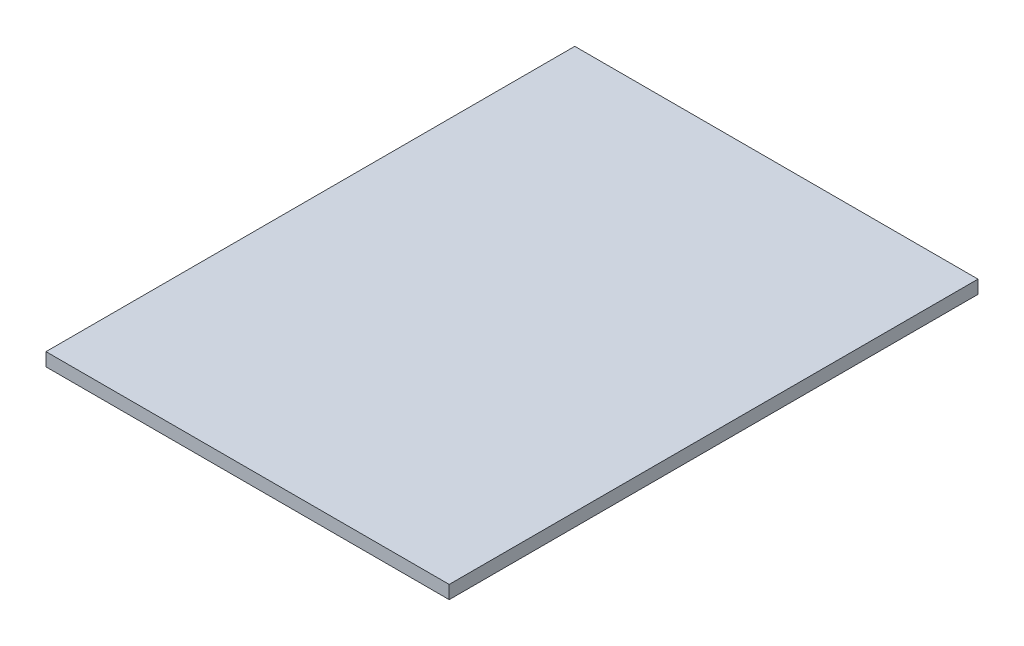
ISO-10303-21;
HEADER;
FILE_DESCRIPTION(('STEP AP214'),'2;1');
FILE_NAME('part.step','',(''),(''),'','','');
FILE_SCHEMA(('AUTOMOTIVE_DESIGN { 1 0 10303 214 1 1 1 1 }'));
ENDSEC;
DATA;
#1=APPLICATION_CONTEXT('core data for automotive mechanical design processes');
#2=APPLICATION_PROTOCOL_DEFINITION('international standard','automotive_design',2000,#1);
#3=PRODUCT_CONTEXT('',#1,'mechanical');
#4=PRODUCT('Part','Part','',(#3));
#5=PRODUCT_RELATED_PRODUCT_CATEGORY('part','',(#4));
#6=PRODUCT_DEFINITION_FORMATION('','',#4);
#7=PRODUCT_DEFINITION_CONTEXT('part definition',#1,'design');
#8=PRODUCT_DEFINITION('design','',#6,#7);
#9=PRODUCT_DEFINITION_SHAPE('','',#8);
#10=(LENGTH_UNIT() NAMED_UNIT(*) SI_UNIT(.MILLI.,.METRE.));
#11=(NAMED_UNIT(*) PLANE_ANGLE_UNIT() SI_UNIT($,.RADIAN.));
#12=(NAMED_UNIT(*) SI_UNIT($,.STERADIAN.) SOLID_ANGLE_UNIT());
#13=UNCERTAINTY_MEASURE_WITH_UNIT(LENGTH_MEASURE(1.E-05),#10,'distance_accuracy_value','');
#14=(GEOMETRIC_REPRESENTATION_CONTEXT(3) GLOBAL_UNCERTAINTY_ASSIGNED_CONTEXT((#13)) GLOBAL_UNIT_ASSIGNED_CONTEXT((#10,
#11,#12)) REPRESENTATION_CONTEXT('',''));
#15=CARTESIAN_POINT('',(0.,0.,0.));
#16=DIRECTION('',(0.,0.,1.));
#17=DIRECTION('',(1.,0.,0.));
#18=AXIS2_PLACEMENT_3D('',#15,#16,#17);
#19=CARTESIAN_POINT('',(30.5,2.,-40.));
#20=DIRECTION('',(-1.,0.,0.));
#21=DIRECTION('',(0.,0.,1.));
#22=AXIS2_PLACEMENT_3D('',#19,#20,#21);
#23=PLANE('',#22);
#24=DIRECTION('',(0.,0.,-1.));
#25=VECTOR('',#24,1.);
#26=CARTESIAN_POINT('',(30.5,0.,-40.));
#27=LINE('',#26,#25);
#28=CARTESIAN_POINT('',(30.5,0.,40.));
#29=VERTEX_POINT('',#28);
#30=CARTESIAN_POINT('',(30.5,0.,-40.));
#31=VERTEX_POINT('',#30);
#32=EDGE_CURVE('E96',#29,#31,#27,.T.);
#33=ORIENTED_EDGE('',*,*,#32,.T.);
#34=DIRECTION('',(0.,-1.,0.));
#35=VECTOR('',#34,1.);
#36=CARTESIAN_POINT('',(30.5,2.,-40.));
#37=LINE('',#36,#35);
#38=CARTESIAN_POINT('',(30.5,2.,-40.));
#39=VERTEX_POINT('',#38);
#40=EDGE_CURVE('E11',#39,#31,#37,.T.);
#41=ORIENTED_EDGE('',*,*,#40,.F.);
#42=DIRECTION('',(0.,0.,-1.));
#43=VECTOR('',#42,1.);
#44=CARTESIAN_POINT('',(30.5,2.,-40.));
#45=LINE('',#44,#43);
#46=CARTESIAN_POINT('',(30.5,2.,40.));
#47=VERTEX_POINT('',#46);
#48=EDGE_CURVE('E84',#47,#39,#45,.T.);
#49=ORIENTED_EDGE('',*,*,#48,.F.);
#50=DIRECTION('',(0.,-1.,0.));
#51=VECTOR('',#50,1.);
#52=CARTESIAN_POINT('',(30.5,2.,40.));
#53=LINE('',#52,#51);
#54=EDGE_CURVE('E92',#47,#29,#53,.T.);
#55=ORIENTED_EDGE('',*,*,#54,.T.);
#56=EDGE_LOOP('',(#33,#41,#49,#55));
#57=FACE_BOUND('',#56,.T.);
#58=ADVANCED_FACE('F33',(#57),#23,.F.);
#59=CARTESIAN_POINT('',(-30.5,2.,-40.));
#60=DIRECTION('',(0.,0.,1.));
#61=DIRECTION('',(1.,0.,0.));
#62=AXIS2_PLACEMENT_3D('',#59,#60,#61);
#63=PLANE('',#62);
#64=DIRECTION('',(-1.,0.,0.));
#65=VECTOR('',#64,1.);
#66=CARTESIAN_POINT('',(-30.5,0.,-40.));
#67=LINE('',#66,#65);
#68=CARTESIAN_POINT('',(-30.5,0.,-40.));
#69=VERTEX_POINT('',#68);
#70=EDGE_CURVE('E88',#31,#69,#67,.T.);
#71=ORIENTED_EDGE('',*,*,#70,.T.);
#72=DIRECTION('',(0.,-1.,0.));
#73=VECTOR('',#72,1.);
#74=CARTESIAN_POINT('',(-30.5,2.,-40.));
#75=LINE('',#74,#73);
#76=CARTESIAN_POINT('',(-30.5,2.,-40.));
#77=VERTEX_POINT('',#76);
#78=EDGE_CURVE('E41',#77,#69,#75,.T.);
#79=ORIENTED_EDGE('',*,*,#78,.F.);
#80=DIRECTION('',(-1.,0.,0.));
#81=VECTOR('',#80,1.);
#82=CARTESIAN_POINT('',(-30.5,2.,-40.));
#83=LINE('',#82,#81);
#84=EDGE_CURVE('E79',#39,#77,#83,.T.);
#85=ORIENTED_EDGE('',*,*,#84,.F.);
#86=ORIENTED_EDGE('',*,*,#40,.T.);
#87=EDGE_LOOP('',(#71,#79,#85,#86));
#88=FACE_BOUND('',#87,.T.);
#89=ADVANCED_FACE('F87',(#88),#63,.F.);
#90=CARTESIAN_POINT('',(-30.5,2.,-40.));
#91=DIRECTION('',(1.,0.,0.));
#92=DIRECTION('',(0.,0.,-1.));
#93=AXIS2_PLACEMENT_3D('',#90,#91,#92);
#94=PLANE('',#93);
#95=DIRECTION('',(0.,0.,1.));
#96=VECTOR('',#95,1.);
#97=CARTESIAN_POINT('',(-30.5,0.,-40.));
#98=LINE('',#97,#96);
#99=CARTESIAN_POINT('',(-30.5,0.,40.));
#100=VERTEX_POINT('',#99);
#101=EDGE_CURVE('E66',#69,#100,#98,.T.);
#102=ORIENTED_EDGE('',*,*,#101,.T.);
#103=DIRECTION('',(0.,-1.,0.));
#104=VECTOR('',#103,1.);
#105=CARTESIAN_POINT('',(-30.5,2.,40.));
#106=LINE('',#105,#104);
#107=CARTESIAN_POINT('',(-30.5,2.,40.));
#108=VERTEX_POINT('',#107);
#109=EDGE_CURVE('E89',#108,#100,#106,.T.);
#110=ORIENTED_EDGE('',*,*,#109,.F.);
#111=DIRECTION('',(0.,0.,1.));
#112=VECTOR('',#111,1.);
#113=CARTESIAN_POINT('',(-30.5,2.,-40.));
#114=LINE('',#113,#112);
#115=EDGE_CURVE('E82',#77,#108,#114,.T.);
#116=ORIENTED_EDGE('',*,*,#115,.F.);
#117=ORIENTED_EDGE('',*,*,#78,.T.);
#118=EDGE_LOOP('',(#102,#110,#116,#117));
#119=FACE_BOUND('',#118,.T.);
#120=ADVANCED_FACE('F90',(#119),#94,.F.);
#121=CARTESIAN_POINT('',(-30.5,2.,40.));
#122=DIRECTION('',(0.,0.,-1.));
#123=DIRECTION('',(-1.,0.,0.));
#124=AXIS2_PLACEMENT_3D('',#121,#122,#123);
#125=PLANE('',#124);
#126=DIRECTION('',(1.,0.,0.));
#127=VECTOR('',#126,1.);
#128=CARTESIAN_POINT('',(-30.5,0.,40.));
#129=LINE('',#128,#127);
#130=EDGE_CURVE('E72',#100,#29,#129,.T.);
#131=ORIENTED_EDGE('',*,*,#130,.T.);
#132=ORIENTED_EDGE('',*,*,#54,.F.);
#133=DIRECTION('',(1.,0.,0.));
#134=VECTOR('',#133,1.);
#135=CARTESIAN_POINT('',(-30.5,2.,40.));
#136=LINE('',#135,#134);
#137=EDGE_CURVE('E49',#108,#47,#136,.T.);
#138=ORIENTED_EDGE('',*,*,#137,.F.);
#139=ORIENTED_EDGE('',*,*,#109,.T.);
#140=EDGE_LOOP('',(#131,#132,#138,#139));
#141=FACE_BOUND('',#140,.T.);
#142=ADVANCED_FACE('F103',(#141),#125,.F.);
#143=CARTESIAN_POINT('',(0.,2.,0.));
#144=DIRECTION('',(0.,1.,0.));
#145=DIRECTION('',(0.,0.,1.));
#146=AXIS2_PLACEMENT_3D('',#143,#144,#145);
#147=PLANE('',#146);
#148=ORIENTED_EDGE('',*,*,#48,.T.);
#149=ORIENTED_EDGE('',*,*,#84,.T.);
#150=ORIENTED_EDGE('',*,*,#115,.T.);
#151=ORIENTED_EDGE('',*,*,#137,.T.);
#152=EDGE_LOOP('',(#148,#149,#150,#151));
#153=FACE_BOUND('',#152,.T.);
#154=ADVANCED_FACE('F80',(#153),#147,.T.);
#155=CARTESIAN_POINT('',(0.,0.,0.));
#156=DIRECTION('',(0.,1.,0.));
#157=DIRECTION('',(0.,0.,1.));
#158=AXIS2_PLACEMENT_3D('',#155,#156,#157);
#159=PLANE('',#158);
#160=ORIENTED_EDGE('',*,*,#32,.F.);
#161=ORIENTED_EDGE('',*,*,#130,.F.);
#162=ORIENTED_EDGE('',*,*,#101,.F.);
#163=ORIENTED_EDGE('',*,*,#70,.F.);
#164=EDGE_LOOP('',(#160,#161,#162,#163));
#165=FACE_BOUND('',#164,.T.);
#166=ADVANCED_FACE('F106',(#165),#159,.F.);
#167=CLOSED_SHELL('',(#58,#89,#120,#142,#154,#166));
#168=MANIFOLD_SOLID_BREP('B2',#167);
#169=ADVANCED_BREP_SHAPE_REPRESENTATION('',(#18,#168),#14);
#170=SHAPE_DEFINITION_REPRESENTATION(#9,#169);
ENDSEC;
END-ISO-10303-21;
